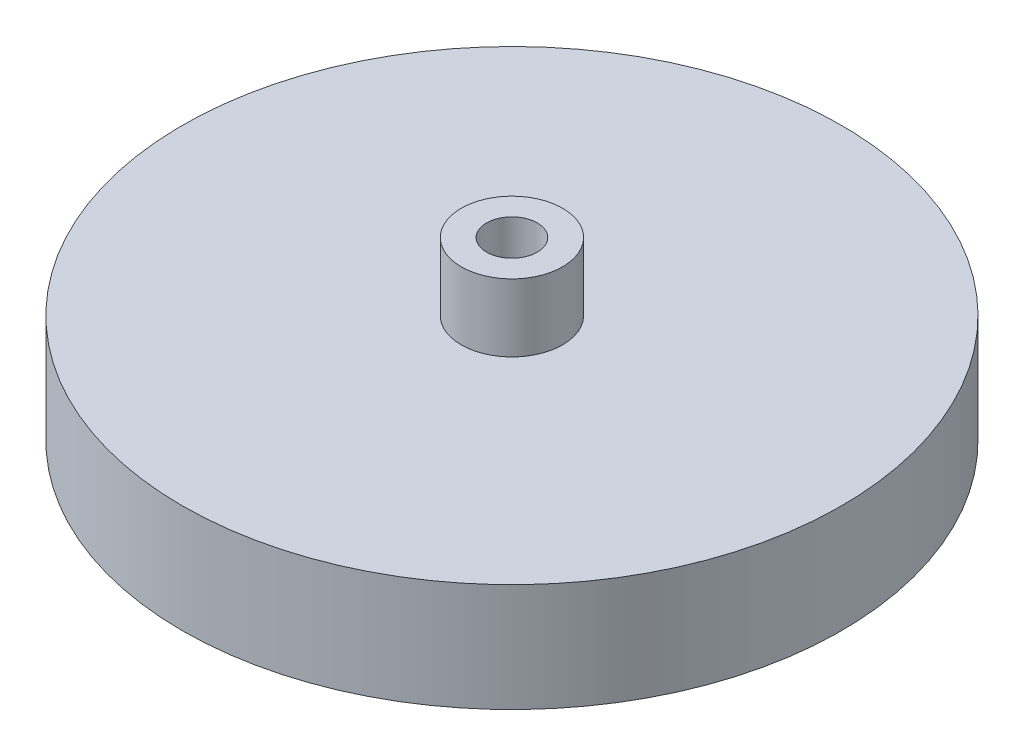
ISO-10303-21;
HEADER;
FILE_DESCRIPTION(('STEP AP214'),'2;1');
FILE_NAME('part.step','',(''),(''),'','','');
FILE_SCHEMA(('AUTOMOTIVE_DESIGN { 1 0 10303 214 1 1 1 1 }'));
ENDSEC;
DATA;
#1=APPLICATION_CONTEXT('core data for automotive mechanical design processes');
#2=APPLICATION_PROTOCOL_DEFINITION('international standard','automotive_design',2000,#1);
#3=PRODUCT_CONTEXT('',#1,'mechanical');
#4=PRODUCT('Part','Part','',(#3));
#5=PRODUCT_RELATED_PRODUCT_CATEGORY('part','',(#4));
#6=PRODUCT_DEFINITION_FORMATION('','',#4);
#7=PRODUCT_DEFINITION_CONTEXT('part definition',#1,'design');
#8=PRODUCT_DEFINITION('design','',#6,#7);
#9=PRODUCT_DEFINITION_SHAPE('','',#8);
#10=(LENGTH_UNIT() NAMED_UNIT(*) SI_UNIT(.MILLI.,.METRE.));
#11=(NAMED_UNIT(*) PLANE_ANGLE_UNIT() SI_UNIT($,.RADIAN.));
#12=(NAMED_UNIT(*) SI_UNIT($,.STERADIAN.) SOLID_ANGLE_UNIT());
#13=UNCERTAINTY_MEASURE_WITH_UNIT(LENGTH_MEASURE(1.E-05),#10,'distance_accuracy_value','');
#14=(GEOMETRIC_REPRESENTATION_CONTEXT(3) GLOBAL_UNCERTAINTY_ASSIGNED_CONTEXT((#13)) GLOBAL_UNIT_ASSIGNED_CONTEXT((#10,
#11,#12)) REPRESENTATION_CONTEXT('',''));
#15=CARTESIAN_POINT('',(0.,0.,0.));
#16=DIRECTION('',(0.,0.,1.));
#17=DIRECTION('',(1.,0.,0.));
#18=AXIS2_PLACEMENT_3D('',#15,#16,#17);
#19=CARTESIAN_POINT('',(0.,20.32,0.));
#20=DIRECTION('',(0.,-1.,0.));
#21=DIRECTION('',(0.,0.,-1.));
#22=AXIS2_PLACEMENT_3D('',#19,#20,#21);
#23=CYLINDRICAL_SURFACE('',#22,61.9125);
#24=CARTESIAN_POINT('',(0.,20.32,0.));
#25=DIRECTION('',(0.,1.,0.));
#26=DIRECTION('',(0.,0.,1.));
#27=AXIS2_PLACEMENT_3D('',#24,#25,#26);
#28=CIRCLE('',#27,61.9125);
#29=CARTESIAN_POINT('',(0.,20.32,61.9125));
#30=VERTEX_POINT('',#29);
#31=EDGE_CURVE('E49',#30,#30,#28,.T.);
#32=ORIENTED_EDGE('',*,*,#31,.F.);
#33=EDGE_LOOP('',(#32));
#34=FACE_BOUND('',#33,.T.);
#35=CARTESIAN_POINT('',(0.,0.,0.));
#36=DIRECTION('',(0.,1.,0.));
#37=DIRECTION('',(0.,0.,1.));
#38=AXIS2_PLACEMENT_3D('',#35,#36,#37);
#39=CIRCLE('',#38,61.9125);
#40=CARTESIAN_POINT('',(0.,0.,61.9125));
#41=VERTEX_POINT('',#40);
#42=EDGE_CURVE('E44',#41,#41,#39,.T.);
#43=ORIENTED_EDGE('',*,*,#42,.T.);
#44=EDGE_LOOP('',(#43));
#45=FACE_BOUND('',#44,.T.);
#46=ADVANCED_FACE('F41',(#34,#45),#23,.T.);
#47=CARTESIAN_POINT('',(0.,20.32,0.));
#48=DIRECTION('',(0.,1.,0.));
#49=DIRECTION('',(0.,0.,1.));
#50=AXIS2_PLACEMENT_3D('',#47,#48,#49);
#51=PLANE('',#50);
#52=CARTESIAN_POINT('',(0.,20.32,0.));
#53=DIRECTION('',(0.,1.,0.));
#54=DIRECTION('',(0.,0.,1.));
#55=AXIS2_PLACEMENT_3D('',#52,#53,#54);
#56=CIRCLE('',#55,9.525);
#57=CARTESIAN_POINT('',(0.,20.32,9.525));
#58=VERTEX_POINT('',#57);
#59=EDGE_CURVE('E10',#58,#58,#56,.T.);
#60=ORIENTED_EDGE('',*,*,#59,.F.);
#61=EDGE_LOOP('',(#60));
#62=FACE_BOUND('',#61,.T.);
#63=ORIENTED_EDGE('',*,*,#31,.T.);
#64=EDGE_LOOP('',(#63));
#65=FACE_BOUND('',#64,.T.);
#66=ADVANCED_FACE('F85',(#62,#65),#51,.T.);
#67=CARTESIAN_POINT('',(0.,0.,0.));
#68=DIRECTION('',(0.,1.,0.));
#69=DIRECTION('',(0.,0.,1.));
#70=AXIS2_PLACEMENT_3D('',#67,#68,#69);
#71=PLANE('',#70);
#72=CARTESIAN_POINT('',(0.,0.,0.));
#73=DIRECTION('',(0.,1.,0.));
#74=DIRECTION('',(0.,0.,1.));
#75=AXIS2_PLACEMENT_3D('',#72,#73,#74);
#76=CIRCLE('',#75,4.7625);
#77=CARTESIAN_POINT('',(0.,0.,4.7625));
#78=VERTEX_POINT('',#77);
#79=EDGE_CURVE('E60',#78,#78,#76,.F.);
#80=ORIENTED_EDGE('',*,*,#79,.F.);
#81=EDGE_LOOP('',(#80));
#82=FACE_BOUND('',#81,.T.);
#83=ORIENTED_EDGE('',*,*,#42,.F.);
#84=EDGE_LOOP('',(#83));
#85=FACE_BOUND('',#84,.T.);
#86=ADVANCED_FACE('F80',(#82,#85),#71,.F.);
#87=CARTESIAN_POINT('',(0.,33.02,0.));
#88=DIRECTION('',(0.,-1.,0.));
#89=DIRECTION('',(0.,0.,-1.));
#90=AXIS2_PLACEMENT_3D('',#87,#88,#89);
#91=CYLINDRICAL_SURFACE('',#90,9.525);
#92=CARTESIAN_POINT('',(0.,33.02,0.));
#93=DIRECTION('',(0.,1.,0.));
#94=DIRECTION('',(0.,0.,1.));
#95=AXIS2_PLACEMENT_3D('',#92,#93,#94);
#96=CIRCLE('',#95,9.525);
#97=CARTESIAN_POINT('',(0.,33.02,9.525));
#98=VERTEX_POINT('',#97);
#99=EDGE_CURVE('E56',#98,#98,#96,.T.);
#100=ORIENTED_EDGE('',*,*,#99,.F.);
#101=EDGE_LOOP('',(#100));
#102=FACE_BOUND('',#101,.T.);
#103=ORIENTED_EDGE('',*,*,#59,.T.);
#104=EDGE_LOOP('',(#103));
#105=FACE_BOUND('',#104,.T.);
#106=ADVANCED_FACE('F75',(#102,#105),#91,.T.);
#107=CARTESIAN_POINT('',(0.,33.02,0.));
#108=DIRECTION('',(0.,1.,0.));
#109=DIRECTION('',(0.,0.,1.));
#110=AXIS2_PLACEMENT_3D('',#107,#108,#109);
#111=PLANE('',#110);
#112=CARTESIAN_POINT('',(0.,33.02,0.));
#113=DIRECTION('',(0.,1.,0.));
#114=DIRECTION('',(0.,0.,1.));
#115=AXIS2_PLACEMENT_3D('',#112,#113,#114);
#116=CIRCLE('',#115,4.7625);
#117=CARTESIAN_POINT('',(0.,33.02,4.7625));
#118=VERTEX_POINT('',#117);
#119=EDGE_CURVE('E64',#118,#118,#116,.T.);
#120=ORIENTED_EDGE('',*,*,#119,.F.);
#121=EDGE_LOOP('',(#120));
#122=FACE_BOUND('',#121,.T.);
#123=ORIENTED_EDGE('',*,*,#99,.T.);
#124=EDGE_LOOP('',(#123));
#125=FACE_BOUND('',#124,.T.);
#126=ADVANCED_FACE('F72',(#122,#125),#111,.T.);
#127=CARTESIAN_POINT('',(0.,-0.001000000000001,0.));
#128=DIRECTION('',(0.,1.,0.));
#129=DIRECTION('',(0.,0.,1.));
#130=AXIS2_PLACEMENT_3D('',#127,#128,#129);
#131=CYLINDRICAL_SURFACE('',#130,4.7625);
#132=ORIENTED_EDGE('',*,*,#119,.T.);
#133=EDGE_LOOP('',(#132));
#134=FACE_BOUND('',#133,.T.);
#135=ORIENTED_EDGE('',*,*,#79,.T.);
#136=EDGE_LOOP('',(#135));
#137=FACE_BOUND('',#136,.T.);
#138=ADVANCED_FACE('F69',(#134,#137),#131,.F.);
#139=CLOSED_SHELL('',(#46,#66,#86,#106,#126,#138));
#140=MANIFOLD_SOLID_BREP('B2',#139);
#141=ADVANCED_BREP_SHAPE_REPRESENTATION('',(#18,#140),#14);
#142=SHAPE_DEFINITION_REPRESENTATION(#9,#141);
ENDSEC;
END-ISO-10303-21;
